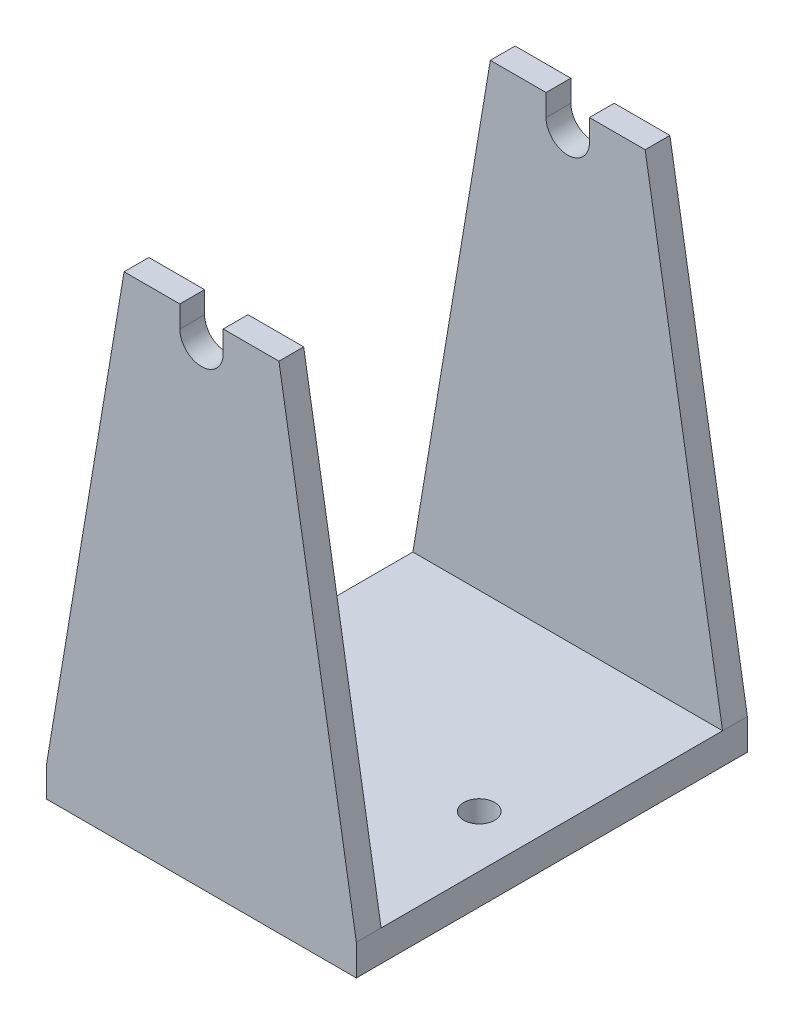
ISO-10303-21;
HEADER;
FILE_DESCRIPTION(('STEP AP214'),'2;1');
FILE_NAME('part.step','',(''),(''),'','','');
FILE_SCHEMA(('AUTOMOTIVE_DESIGN { 1 0 10303 214 1 1 1 1 }'));
ENDSEC;
DATA;
#1=APPLICATION_CONTEXT('core data for automotive mechanical design processes');
#2=APPLICATION_PROTOCOL_DEFINITION('international standard','automotive_design',2000,#1);
#3=PRODUCT_CONTEXT('',#1,'mechanical');
#4=PRODUCT('Part','Part','',(#3));
#5=PRODUCT_RELATED_PRODUCT_CATEGORY('part','',(#4));
#6=PRODUCT_DEFINITION_FORMATION('','',#4);
#7=PRODUCT_DEFINITION_CONTEXT('part definition',#1,'design');
#8=PRODUCT_DEFINITION('design','',#6,#7);
#9=PRODUCT_DEFINITION_SHAPE('','',#8);
#10=(LENGTH_UNIT() NAMED_UNIT(*) SI_UNIT(.MILLI.,.METRE.));
#11=(NAMED_UNIT(*) PLANE_ANGLE_UNIT() SI_UNIT($,.RADIAN.));
#12=(NAMED_UNIT(*) SI_UNIT($,.STERADIAN.) SOLID_ANGLE_UNIT());
#13=UNCERTAINTY_MEASURE_WITH_UNIT(LENGTH_MEASURE(1.E-05),#10,'distance_accuracy_value','');
#14=(GEOMETRIC_REPRESENTATION_CONTEXT(3) GLOBAL_UNCERTAINTY_ASSIGNED_CONTEXT((#13)) GLOBAL_UNIT_ASSIGNED_CONTEXT((#10,
#11,#12)) REPRESENTATION_CONTEXT('',''));
#15=CARTESIAN_POINT('',(0.,0.,0.));
#16=DIRECTION('',(0.,0.,1.));
#17=DIRECTION('',(1.,0.,0.));
#18=AXIS2_PLACEMENT_3D('',#15,#16,#17);
#19=CARTESIAN_POINT('',(0.,76.5,4.));
#20=DIRECTION('',(0.,0.,-1.));
#21=DIRECTION('',(-1.,0.,0.));
#22=AXIS2_PLACEMENT_3D('',#19,#20,#21);
#23=PLANE('',#22);
#24=DIRECTION('',(-1.,0.,0.));
#25=VECTOR('',#24,1.);
#26=CARTESIAN_POINT('',(-25.,5.,4.));
#27=LINE('',#26,#25);
#28=CARTESIAN_POINT('',(25.,5.00000000000001,4.));
#29=VERTEX_POINT('',#28);
#30=CARTESIAN_POINT('',(-25.,5.,4.));
#31=VERTEX_POINT('',#30);
#32=EDGE_CURVE('E121',#29,#31,#27,.T.);
#33=ORIENTED_EDGE('',*,*,#32,.F.);
#34=DIRECTION('',(-0.164398987305357,0.986393923832144,0.));
#35=VECTOR('',#34,1.);
#36=CARTESIAN_POINT('',(25.,5.00000000000001,4.));
#37=LINE('',#36,#35);
#38=CARTESIAN_POINT('',(12.5,80.,4.));
#39=VERTEX_POINT('',#38);
#40=EDGE_CURVE('E115',#29,#39,#37,.T.);
#41=ORIENTED_EDGE('',*,*,#40,.T.);
#42=DIRECTION('',(-1.,0.,0.));
#43=VECTOR('',#42,1.);
#44=CARTESIAN_POINT('',(12.5,80.,4.));
#45=LINE('',#44,#43);
#46=CARTESIAN_POINT('',(3.49999999999999,80.,4.));
#47=VERTEX_POINT('',#46);
#48=EDGE_CURVE('E118',#39,#47,#45,.T.);
#49=ORIENTED_EDGE('',*,*,#48,.T.);
#50=DIRECTION('',(0.,-1.,0.));
#51=VECTOR('',#50,1.);
#52=CARTESIAN_POINT('',(3.49999999999999,76.5,4.));
#53=LINE('',#52,#51);
#54=CARTESIAN_POINT('',(3.49999999999999,76.5,4.));
#55=VERTEX_POINT('',#54);
#56=EDGE_CURVE('E52',#47,#55,#53,.T.);
#57=ORIENTED_EDGE('',*,*,#56,.T.);
#58=CARTESIAN_POINT('',(0.,76.5,4.));
#59=DIRECTION('',(0.,0.,-1.));
#60=DIRECTION('',(-1.,0.,0.));
#61=AXIS2_PLACEMENT_3D('',#58,#59,#60);
#62=CIRCLE('',#61,3.5);
#63=CARTESIAN_POINT('',(-3.50000000000001,76.5,4.));
#64=VERTEX_POINT('',#63);
#65=EDGE_CURVE('E160',#55,#64,#62,.T.);
#66=ORIENTED_EDGE('',*,*,#65,.T.);
#67=DIRECTION('',(0.,1.,0.));
#68=VECTOR('',#67,1.);
#69=CARTESIAN_POINT('',(-3.50000000000001,76.5,4.));
#70=LINE('',#69,#68);
#71=CARTESIAN_POINT('',(-3.50000000000001,80.,4.));
#72=VERTEX_POINT('',#71);
#73=EDGE_CURVE('E102',#64,#72,#70,.T.);
#74=ORIENTED_EDGE('',*,*,#73,.T.);
#75=DIRECTION('',(-1.,0.,0.));
#76=VECTOR('',#75,1.);
#77=CARTESIAN_POINT('',(-12.5,80.,4.));
#78=LINE('',#77,#76);
#79=CARTESIAN_POINT('',(-12.5,80.,4.));
#80=VERTEX_POINT('',#79);
#81=EDGE_CURVE('E276',#72,#80,#78,.T.);
#82=ORIENTED_EDGE('',*,*,#81,.T.);
#83=DIRECTION('',(-0.164398987305357,-0.986393923832144,0.));
#84=VECTOR('',#83,1.);
#85=CARTESIAN_POINT('',(-25.,5.,4.));
#86=LINE('',#85,#84);
#87=EDGE_CURVE('E126',#80,#31,#86,.T.);
#88=ORIENTED_EDGE('',*,*,#87,.T.);
#89=EDGE_LOOP('',(#33,#41,#49,#57,#66,#74,#82,#88));
#90=FACE_BOUND('',#89,.T.);
#91=ADVANCED_FACE('F33',(#90),#23,.F.);
#92=CARTESIAN_POINT('',(0.,76.5,4.));
#93=DIRECTION('',(0.,0.,-1.));
#94=DIRECTION('',(-1.,0.,0.));
#95=AXIS2_PLACEMENT_3D('',#92,#93,#94);
#96=CYLINDRICAL_SURFACE('',#95,3.5);
#97=CARTESIAN_POINT('',(0.,76.5,0.));
#98=DIRECTION('',(0.,0.,-1.));
#99=DIRECTION('',(-1.,0.,0.));
#100=AXIS2_PLACEMENT_3D('',#97,#98,#99);
#101=CIRCLE('',#100,3.5);
#102=CARTESIAN_POINT('',(3.49999999999999,76.5,0.));
#103=VERTEX_POINT('',#102);
#104=CARTESIAN_POINT('',(-3.50000000000001,76.5,0.));
#105=VERTEX_POINT('',#104);
#106=EDGE_CURVE('E141',#103,#105,#101,.T.);
#107=ORIENTED_EDGE('',*,*,#106,.T.);
#108=DIRECTION('',(0.,0.,-1.));
#109=VECTOR('',#108,1.);
#110=CARTESIAN_POINT('',(-3.50000000000001,76.5,4.));
#111=LINE('',#110,#109);
#112=EDGE_CURVE('E11',#64,#105,#111,.T.);
#113=ORIENTED_EDGE('',*,*,#112,.F.);
#114=ORIENTED_EDGE('',*,*,#65,.F.);
#115=DIRECTION('',(0.,0.,-1.));
#116=VECTOR('',#115,1.);
#117=CARTESIAN_POINT('',(3.49999999999999,76.5,4.));
#118=LINE('',#117,#116);
#119=EDGE_CURVE('E137',#55,#103,#118,.T.);
#120=ORIENTED_EDGE('',*,*,#119,.T.);
#121=EDGE_LOOP('',(#107,#113,#114,#120));
#122=FACE_BOUND('',#121,.T.);
#123=ADVANCED_FACE('F35',(#122),#96,.F.);
#124=CARTESIAN_POINT('',(-3.50000000000001,76.5,4.));
#125=DIRECTION('',(-1.,0.,0.));
#126=DIRECTION('',(0.,-1.,0.));
#127=AXIS2_PLACEMENT_3D('',#124,#125,#126);
#128=PLANE('',#127);
#129=DIRECTION('',(0.,1.,0.));
#130=VECTOR('',#129,1.);
#131=CARTESIAN_POINT('',(-3.50000000000001,76.5,0.));
#132=LINE('',#131,#130);
#133=CARTESIAN_POINT('',(-3.50000000000001,80.,0.));
#134=VERTEX_POINT('',#133);
#135=EDGE_CURVE('E144',#105,#134,#132,.T.);
#136=ORIENTED_EDGE('',*,*,#135,.T.);
#137=DIRECTION('',(0.,0.,-1.));
#138=VECTOR('',#137,1.);
#139=CARTESIAN_POINT('',(-3.50000000000001,80.,4.));
#140=LINE('',#139,#138);
#141=EDGE_CURVE('E43',#72,#134,#140,.T.);
#142=ORIENTED_EDGE('',*,*,#141,.F.);
#143=ORIENTED_EDGE('',*,*,#73,.F.);
#144=ORIENTED_EDGE('',*,*,#112,.T.);
#145=EDGE_LOOP('',(#136,#142,#143,#144));
#146=FACE_BOUND('',#145,.T.);
#147=ADVANCED_FACE('F383',(#146),#128,.F.);
#148=CARTESIAN_POINT('',(-12.5,80.,4.));
#149=DIRECTION('',(0.,-1.,0.));
#150=DIRECTION('',(0.,0.,-1.));
#151=AXIS2_PLACEMENT_3D('',#148,#149,#150);
#152=PLANE('',#151);
#153=DIRECTION('',(-1.,0.,0.));
#154=VECTOR('',#153,1.);
#155=CARTESIAN_POINT('',(-12.5,80.,0.));
#156=LINE('',#155,#154);
#157=CARTESIAN_POINT('',(-12.5,80.,0.));
#158=VERTEX_POINT('',#157);
#159=EDGE_CURVE('E147',#134,#158,#156,.T.);
#160=ORIENTED_EDGE('',*,*,#159,.T.);
#161=DIRECTION('',(0.,0.,-1.));
#162=VECTOR('',#161,1.);
#163=CARTESIAN_POINT('',(-12.5,80.,4.));
#164=LINE('',#163,#162);
#165=EDGE_CURVE('E173',#80,#158,#164,.T.);
#166=ORIENTED_EDGE('',*,*,#165,.F.);
#167=ORIENTED_EDGE('',*,*,#81,.F.);
#168=ORIENTED_EDGE('',*,*,#141,.T.);
#169=EDGE_LOOP('',(#160,#166,#167,#168));
#170=FACE_BOUND('',#169,.T.);
#171=ADVANCED_FACE('F431',(#170),#152,.F.);
#172=CARTESIAN_POINT('',(-25.,5.,4.));
#173=DIRECTION('',(0.986393923832144,-0.164398987305357,0.));
#174=DIRECTION('',(0.164398987305357,0.986393923832144,0.));
#175=AXIS2_PLACEMENT_3D('',#172,#173,#174);
#176=PLANE('',#175);
#177=DIRECTION('',(-0.164398987305357,-0.986393923832144,0.));
#178=VECTOR('',#177,1.);
#179=CARTESIAN_POINT('',(-25.,5.,0.));
#180=LINE('',#179,#178);
#181=CARTESIAN_POINT('',(-25.,5.,0.));
#182=VERTEX_POINT('',#181);
#183=EDGE_CURVE('E149',#158,#182,#180,.T.);
#184=ORIENTED_EDGE('',*,*,#183,.T.);
#185=DIRECTION('',(0.,0.,-1.));
#186=VECTOR('',#185,1.);
#187=CARTESIAN_POINT('',(-25.,5.,4.));
#188=LINE('',#187,#186);
#189=EDGE_CURVE('E170',#31,#182,#188,.T.);
#190=ORIENTED_EDGE('',*,*,#189,.F.);
#191=ORIENTED_EDGE('',*,*,#87,.F.);
#192=ORIENTED_EDGE('',*,*,#165,.T.);
#193=EDGE_LOOP('',(#184,#190,#191,#192));
#194=FACE_BOUND('',#193,.T.);
#195=ADVANCED_FACE('F429',(#194),#176,.F.);
#196=CARTESIAN_POINT('',(-25.,0.,4.));
#197=DIRECTION('',(1.,0.,0.));
#198=DIRECTION('',(0.,1.,0.));
#199=AXIS2_PLACEMENT_3D('',#196,#197,#198);
#200=PLANE('',#199);
#201=DIRECTION('',(0.,-1.,0.));
#202=VECTOR('',#201,1.);
#203=CARTESIAN_POINT('',(-25.,0.,0.));
#204=LINE('',#203,#202);
#205=CARTESIAN_POINT('',(-25.,0.,0.));
#206=VERTEX_POINT('',#205);
#207=EDGE_CURVE('E151',#182,#206,#204,.T.);
#208=ORIENTED_EDGE('',*,*,#207,.T.);
#209=DIRECTION('',(0.,0.,-1.));
#210=VECTOR('',#209,1.);
#211=CARTESIAN_POINT('',(-25.,0.,4.));
#212=LINE('',#211,#210);
#213=CARTESIAN_POINT('',(-25.,0.,63.13));
#214=VERTEX_POINT('',#213);
#215=EDGE_CURVE('E167',#214,#206,#212,.T.);
#216=ORIENTED_EDGE('',*,*,#215,.F.);
#217=DIRECTION('',(0.,-1.,0.));
#218=VECTOR('',#217,1.);
#219=CARTESIAN_POINT('',(-25.,5.,63.13));
#220=LINE('',#219,#218);
#221=CARTESIAN_POINT('',(-25.,5.,63.13));
#222=VERTEX_POINT('',#221);
#223=EDGE_CURVE('E205',#222,#214,#220,.T.);
#224=ORIENTED_EDGE('',*,*,#223,.F.);
#225=DIRECTION('',(0.,0.,-1.));
#226=VECTOR('',#225,1.);
#227=CARTESIAN_POINT('',(-25.,5.,63.13));
#228=LINE('',#227,#226);
#229=CARTESIAN_POINT('',(-25.,5.,59.13));
#230=VERTEX_POINT('',#229);
#231=EDGE_CURVE('E254',#222,#230,#228,.T.);
#232=ORIENTED_EDGE('',*,*,#231,.T.);
#233=DIRECTION('',(0.,0.,-1.));
#234=VECTOR('',#233,1.);
#235=CARTESIAN_POINT('',(-25.,5.,59.13));
#236=LINE('',#235,#234);
#237=EDGE_CURVE('E269',#230,#31,#236,.T.);
#238=ORIENTED_EDGE('',*,*,#237,.T.);
#239=ORIENTED_EDGE('',*,*,#189,.T.);
#240=EDGE_LOOP('',(#208,#216,#224,#232,#238,#239));
#241=FACE_BOUND('',#240,.T.);
#242=ADVANCED_FACE('F290',(#241),#200,.F.);
#243=CARTESIAN_POINT('',(-25.,0.,4.));
#244=DIRECTION('',(0.,1.,0.));
#245=DIRECTION('',(-1.,0.,0.));
#246=AXIS2_PLACEMENT_3D('',#243,#244,#245);
#247=PLANE('',#246);
#248=CARTESIAN_POINT('',(-8.37977463032979,0.,34.9083674305388));
#249=DIRECTION('',(0.,1.,0.));
#250=DIRECTION('',(-1.,0.,0.));
#251=AXIS2_PLACEMENT_3D('',#248,#249,#250);
#252=CIRCLE('',#251,2.49999999999998);
#253=CARTESIAN_POINT('',(-10.8797746303298,0.,34.9083674305388));
#254=VERTEX_POINT('',#253);
#255=EDGE_CURVE('E37',#254,#254,#252,.T.);
#256=ORIENTED_EDGE('',*,*,#255,.T.);
#257=EDGE_LOOP('',(#256));
#258=FACE_BOUND('',#257,.T.);
#259=CARTESIAN_POINT('',(16.6202253696703,0.,34.9083674305388));
#260=DIRECTION('',(0.,1.,0.));
#261=DIRECTION('',(-1.,0.,0.));
#262=AXIS2_PLACEMENT_3D('',#259,#260,#261);
#263=CIRCLE('',#262,2.49999999999998);
#264=CARTESIAN_POINT('',(14.1202253696704,0.,34.9083674305388));
#265=VERTEX_POINT('',#264);
#266=EDGE_CURVE('E179',#265,#265,#263,.T.);
#267=ORIENTED_EDGE('',*,*,#266,.T.);
#268=EDGE_LOOP('',(#267));
#269=FACE_BOUND('',#268,.T.);
#270=DIRECTION('',(1.,0.,0.));
#271=VECTOR('',#270,1.);
#272=CARTESIAN_POINT('',(-25.,0.,0.));
#273=LINE('',#272,#271);
#274=CARTESIAN_POINT('',(25.,0.,0.));
#275=VERTEX_POINT('',#274);
#276=EDGE_CURVE('E153',#206,#275,#273,.T.);
#277=ORIENTED_EDGE('',*,*,#276,.T.);
#278=DIRECTION('',(0.,0.,-1.));
#279=VECTOR('',#278,1.);
#280=CARTESIAN_POINT('',(25.,0.,4.));
#281=LINE('',#280,#279);
#282=CARTESIAN_POINT('',(25.,0.,63.13));
#283=VERTEX_POINT('',#282);
#284=EDGE_CURVE('E164',#283,#275,#281,.T.);
#285=ORIENTED_EDGE('',*,*,#284,.F.);
#286=DIRECTION('',(1.,0.,0.));
#287=VECTOR('',#286,1.);
#288=CARTESIAN_POINT('',(-25.,0.,63.13));
#289=LINE('',#288,#287);
#290=EDGE_CURVE('E208',#214,#283,#289,.T.);
#291=ORIENTED_EDGE('',*,*,#290,.F.);
#292=ORIENTED_EDGE('',*,*,#215,.T.);
#293=EDGE_LOOP('',(#277,#285,#291,#292));
#294=FACE_BOUND('',#293,.T.);
#295=ADVANCED_FACE('F423',(#258,#269,#294),#247,.F.);
#296=CARTESIAN_POINT('',(25.,0.,4.));
#297=DIRECTION('',(-1.,0.,0.));
#298=DIRECTION('',(0.,0.,1.));
#299=AXIS2_PLACEMENT_3D('',#296,#297,#298);
#300=PLANE('',#299);
#301=DIRECTION('',(0.,1.,0.));
#302=VECTOR('',#301,1.);
#303=CARTESIAN_POINT('',(25.,0.,0.));
#304=LINE('',#303,#302);
#305=CARTESIAN_POINT('',(25.,5.00000000000001,0.));
#306=VERTEX_POINT('',#305);
#307=EDGE_CURVE('E155',#275,#306,#304,.T.);
#308=ORIENTED_EDGE('',*,*,#307,.T.);
#309=DIRECTION('',(0.,0.,-1.));
#310=VECTOR('',#309,1.);
#311=CARTESIAN_POINT('',(25.,5.00000000000001,4.));
#312=LINE('',#311,#310);
#313=EDGE_CURVE('E132',#29,#306,#312,.T.);
#314=ORIENTED_EDGE('',*,*,#313,.F.);
#315=DIRECTION('',(0.,0.,-1.));
#316=VECTOR('',#315,1.);
#317=CARTESIAN_POINT('',(25.,5.,59.13));
#318=LINE('',#317,#316);
#319=CARTESIAN_POINT('',(25.,5.,59.13));
#320=VERTEX_POINT('',#319);
#321=EDGE_CURVE('E145',#320,#29,#318,.T.);
#322=ORIENTED_EDGE('',*,*,#321,.F.);
#323=DIRECTION('',(0.,0.,-1.));
#324=VECTOR('',#323,1.);
#325=CARTESIAN_POINT('',(25.,5.00000000000001,63.13));
#326=LINE('',#325,#324);
#327=CARTESIAN_POINT('',(25.,5.00000000000001,63.13));
#328=VERTEX_POINT('',#327);
#329=EDGE_CURVE('E251',#328,#320,#326,.T.);
#330=ORIENTED_EDGE('',*,*,#329,.F.);
#331=DIRECTION('',(0.,1.,0.));
#332=VECTOR('',#331,1.);
#333=CARTESIAN_POINT('',(25.,0.,63.13));
#334=LINE('',#333,#332);
#335=EDGE_CURVE('E211',#283,#328,#334,.T.);
#336=ORIENTED_EDGE('',*,*,#335,.F.);
#337=ORIENTED_EDGE('',*,*,#284,.T.);
#338=EDGE_LOOP('',(#308,#314,#322,#330,#336,#337));
#339=FACE_BOUND('',#338,.T.);
#340=ADVANCED_FACE('F335',(#339),#300,.F.);
#341=CARTESIAN_POINT('',(25.,5.00000000000001,4.));
#342=DIRECTION('',(-0.986393923832144,-0.164398987305357,0.));
#343=DIRECTION('',(0.164398987305357,-0.986393923832144,0.));
#344=AXIS2_PLACEMENT_3D('',#341,#342,#343);
#345=PLANE('',#344);
#346=DIRECTION('',(-0.164398987305357,0.986393923832144,0.));
#347=VECTOR('',#346,1.);
#348=CARTESIAN_POINT('',(25.,5.00000000000001,0.));
#349=LINE('',#348,#347);
#350=CARTESIAN_POINT('',(12.5,80.,0.));
#351=VERTEX_POINT('',#350);
#352=EDGE_CURVE('E131',#306,#351,#349,.T.);
#353=ORIENTED_EDGE('',*,*,#352,.T.);
#354=DIRECTION('',(0.,0.,-1.));
#355=VECTOR('',#354,1.);
#356=CARTESIAN_POINT('',(12.5,80.,4.));
#357=LINE('',#356,#355);
#358=EDGE_CURVE('E128',#39,#351,#357,.T.);
#359=ORIENTED_EDGE('',*,*,#358,.F.);
#360=ORIENTED_EDGE('',*,*,#40,.F.);
#361=ORIENTED_EDGE('',*,*,#313,.T.);
#362=EDGE_LOOP('',(#353,#359,#360,#361));
#363=FACE_BOUND('',#362,.T.);
#364=ADVANCED_FACE('F129',(#363),#345,.F.);
#365=CARTESIAN_POINT('',(12.5,80.,4.));
#366=DIRECTION('',(0.,-1.,0.));
#367=DIRECTION('',(1.,0.,0.));
#368=AXIS2_PLACEMENT_3D('',#365,#366,#367);
#369=PLANE('',#368);
#370=DIRECTION('',(-1.,0.,0.));
#371=VECTOR('',#370,1.);
#372=CARTESIAN_POINT('',(12.5,80.,0.));
#373=LINE('',#372,#371);
#374=CARTESIAN_POINT('',(3.49999999999999,80.,0.));
#375=VERTEX_POINT('',#374);
#376=EDGE_CURVE('E88',#351,#375,#373,.T.);
#377=ORIENTED_EDGE('',*,*,#376,.T.);
#378=DIRECTION('',(0.,0.,-1.));
#379=VECTOR('',#378,1.);
#380=CARTESIAN_POINT('',(3.49999999999999,80.,4.));
#381=LINE('',#380,#379);
#382=EDGE_CURVE('E133',#47,#375,#381,.T.);
#383=ORIENTED_EDGE('',*,*,#382,.F.);
#384=ORIENTED_EDGE('',*,*,#48,.F.);
#385=ORIENTED_EDGE('',*,*,#358,.T.);
#386=EDGE_LOOP('',(#377,#383,#384,#385));
#387=FACE_BOUND('',#386,.T.);
#388=ADVANCED_FACE('F135',(#387),#369,.F.);
#389=CARTESIAN_POINT('',(3.49999999999999,76.5,4.));
#390=DIRECTION('',(1.,0.,0.));
#391=DIRECTION('',(0.,1.,0.));
#392=AXIS2_PLACEMENT_3D('',#389,#390,#391);
#393=PLANE('',#392);
#394=DIRECTION('',(0.,-1.,0.));
#395=VECTOR('',#394,1.);
#396=CARTESIAN_POINT('',(3.49999999999999,76.5,0.));
#397=LINE('',#396,#395);
#398=EDGE_CURVE('E94',#375,#103,#397,.T.);
#399=ORIENTED_EDGE('',*,*,#398,.T.);
#400=ORIENTED_EDGE('',*,*,#119,.F.);
#401=ORIENTED_EDGE('',*,*,#56,.F.);
#402=ORIENTED_EDGE('',*,*,#382,.T.);
#403=EDGE_LOOP('',(#399,#400,#401,#402));
#404=FACE_BOUND('',#403,.T.);
#405=ADVANCED_FACE('F369',(#404),#393,.F.);
#406=CARTESIAN_POINT('',(0.,76.5,0.));
#407=DIRECTION('',(0.,0.,-1.));
#408=DIRECTION('',(-1.,0.,0.));
#409=AXIS2_PLACEMENT_3D('',#406,#407,#408);
#410=PLANE('',#409);
#411=ORIENTED_EDGE('',*,*,#106,.F.);
#412=ORIENTED_EDGE('',*,*,#398,.F.);
#413=ORIENTED_EDGE('',*,*,#376,.F.);
#414=ORIENTED_EDGE('',*,*,#352,.F.);
#415=ORIENTED_EDGE('',*,*,#307,.F.);
#416=ORIENTED_EDGE('',*,*,#276,.F.);
#417=ORIENTED_EDGE('',*,*,#207,.F.);
#418=ORIENTED_EDGE('',*,*,#183,.F.);
#419=ORIENTED_EDGE('',*,*,#159,.F.);
#420=ORIENTED_EDGE('',*,*,#135,.F.);
#421=EDGE_LOOP('',(#411,#412,#413,#414,#415,#416,#417,#418,#419,#420));
#422=FACE_BOUND('',#421,.T.);
#423=ADVANCED_FACE('F364',(#422),#410,.T.);
#424=CARTESIAN_POINT('',(-25.,5.,59.13));
#425=DIRECTION('',(0.,-1.,0.));
#426=DIRECTION('',(0.,0.,-1.));
#427=AXIS2_PLACEMENT_3D('',#424,#425,#426);
#428=PLANE('',#427);
#429=CARTESIAN_POINT('',(-8.37977463032979,5.,34.9083674305388));
#430=DIRECTION('',(0.,-1.,0.));
#431=DIRECTION('',(0.,0.,-1.));
#432=AXIS2_PLACEMENT_3D('',#429,#430,#431);
#433=CIRCLE('',#432,2.49999999999998);
#434=CARTESIAN_POINT('',(-8.37977463032979,5.,32.4083674305388));
#435=VERTEX_POINT('',#434);
#436=EDGE_CURVE('E180',#435,#435,#433,.T.);
#437=ORIENTED_EDGE('',*,*,#436,.T.);
#438=EDGE_LOOP('',(#437));
#439=FACE_BOUND('',#438,.T.);
#440=CARTESIAN_POINT('',(16.6202253696703,5.,34.9083674305388));
#441=DIRECTION('',(0.,-1.,0.));
#442=DIRECTION('',(0.,0.,-1.));
#443=AXIS2_PLACEMENT_3D('',#440,#441,#442);
#444=CIRCLE('',#443,2.49999999999998);
#445=CARTESIAN_POINT('',(16.6202253696703,5.,32.4083674305388));
#446=VERTEX_POINT('',#445);
#447=EDGE_CURVE('E177',#446,#446,#444,.T.);
#448=ORIENTED_EDGE('',*,*,#447,.T.);
#449=EDGE_LOOP('',(#448));
#450=FACE_BOUND('',#449,.T.);
#451=ORIENTED_EDGE('',*,*,#32,.T.);
#452=ORIENTED_EDGE('',*,*,#237,.F.);
#453=DIRECTION('',(-1.,0.,0.));
#454=VECTOR('',#453,1.);
#455=CARTESIAN_POINT('',(-25.,5.,59.13));
#456=LINE('',#455,#454);
#457=EDGE_CURVE('E266',#320,#230,#456,.T.);
#458=ORIENTED_EDGE('',*,*,#457,.F.);
#459=ORIENTED_EDGE('',*,*,#321,.T.);
#460=EDGE_LOOP('',(#451,#452,#458,#459));
#461=FACE_BOUND('',#460,.T.);
#462=ADVANCED_FACE('F285',(#439,#450,#461),#428,.F.);
#463=CARTESIAN_POINT('',(0.,76.5,59.13));
#464=DIRECTION('',(0.,0.,1.));
#465=DIRECTION('',(1.,0.,0.));
#466=AXIS2_PLACEMENT_3D('',#463,#464,#465);
#467=PLANE('',#466);
#468=DIRECTION('',(-0.164398987305357,0.986393923832144,0.));
#469=VECTOR('',#468,1.);
#470=CARTESIAN_POINT('',(25.,5.00000000000001,59.13));
#471=LINE('',#470,#469);
#472=CARTESIAN_POINT('',(12.5,80.,59.13));
#473=VERTEX_POINT('',#472);
#474=EDGE_CURVE('E235',#320,#473,#471,.T.);
#475=ORIENTED_EDGE('',*,*,#474,.F.);
#476=ORIENTED_EDGE('',*,*,#457,.T.);
#477=DIRECTION('',(-0.164398987305357,-0.986393923832144,0.));
#478=VECTOR('',#477,1.);
#479=CARTESIAN_POINT('',(-12.5,80.,59.13));
#480=LINE('',#479,#478);
#481=CARTESIAN_POINT('',(-12.5,80.,59.13));
#482=VERTEX_POINT('',#481);
#483=EDGE_CURVE('E232',#482,#230,#480,.T.);
#484=ORIENTED_EDGE('',*,*,#483,.F.);
#485=DIRECTION('',(-1.,0.,0.));
#486=VECTOR('',#485,1.);
#487=CARTESIAN_POINT('',(-3.50000000000001,80.,59.13));
#488=LINE('',#487,#486);
#489=CARTESIAN_POINT('',(-3.50000000000001,80.,59.13));
#490=VERTEX_POINT('',#489);
#491=EDGE_CURVE('E229',#490,#482,#488,.T.);
#492=ORIENTED_EDGE('',*,*,#491,.F.);
#493=DIRECTION('',(0.,1.,0.));
#494=VECTOR('',#493,1.);
#495=CARTESIAN_POINT('',(-3.50000000000001,76.5,59.13));
#496=LINE('',#495,#494);
#497=CARTESIAN_POINT('',(-3.50000000000001,76.5,59.13));
#498=VERTEX_POINT('',#497);
#499=EDGE_CURVE('E226',#498,#490,#496,.T.);
#500=ORIENTED_EDGE('',*,*,#499,.F.);
#501=CARTESIAN_POINT('',(0.,76.5,59.13));
#502=DIRECTION('',(0.,0.,-1.));
#503=DIRECTION('',(1.,0.,0.));
#504=AXIS2_PLACEMENT_3D('',#501,#502,#503);
#505=CIRCLE('',#504,3.5);
#506=CARTESIAN_POINT('',(3.49999999999999,76.5,59.13));
#507=VERTEX_POINT('',#506);
#508=EDGE_CURVE('E184',#507,#498,#505,.T.);
#509=ORIENTED_EDGE('',*,*,#508,.F.);
#510=DIRECTION('',(0.,-1.,0.));
#511=VECTOR('',#510,1.);
#512=CARTESIAN_POINT('',(3.49999999999999,80.,59.13));
#513=LINE('',#512,#511);
#514=CARTESIAN_POINT('',(3.49999999999999,80.,59.13));
#515=VERTEX_POINT('',#514);
#516=EDGE_CURVE('E196',#515,#507,#513,.T.);
#517=ORIENTED_EDGE('',*,*,#516,.F.);
#518=DIRECTION('',(-1.,0.,0.));
#519=VECTOR('',#518,1.);
#520=CARTESIAN_POINT('',(12.5,80.,59.13));
#521=LINE('',#520,#519);
#522=EDGE_CURVE('E238',#473,#515,#521,.T.);
#523=ORIENTED_EDGE('',*,*,#522,.F.);
#524=EDGE_LOOP('',(#475,#476,#484,#492,#500,#509,#517,#523));
#525=FACE_BOUND('',#524,.T.);
#526=ADVANCED_FACE('F344',(#525),#467,.F.);
#527=CARTESIAN_POINT('',(0.,76.5,63.13));
#528=DIRECTION('',(0.,0.,-1.));
#529=DIRECTION('',(-1.,0.,0.));
#530=AXIS2_PLACEMENT_3D('',#527,#528,#529);
#531=CYLINDRICAL_SURFACE('',#530,3.5);
#532=ORIENTED_EDGE('',*,*,#508,.T.);
#533=DIRECTION('',(0.,0.,-1.));
#534=VECTOR('',#533,1.);
#535=CARTESIAN_POINT('',(-3.50000000000001,76.5,63.13));
#536=LINE('',#535,#534);
#537=CARTESIAN_POINT('',(-3.50000000000001,76.5,63.13));
#538=VERTEX_POINT('',#537);
#539=EDGE_CURVE('E263',#538,#498,#536,.T.);
#540=ORIENTED_EDGE('',*,*,#539,.F.);
#541=CARTESIAN_POINT('',(0.,76.5,63.13));
#542=DIRECTION('',(0.,0.,-1.));
#543=DIRECTION('',(1.,0.,0.));
#544=AXIS2_PLACEMENT_3D('',#541,#542,#543);
#545=CIRCLE('',#544,3.5);
#546=CARTESIAN_POINT('',(3.49999999999999,76.5,63.13));
#547=VERTEX_POINT('',#546);
#548=EDGE_CURVE('E192',#547,#538,#545,.T.);
#549=ORIENTED_EDGE('',*,*,#548,.F.);
#550=DIRECTION('',(0.,0.,-1.));
#551=VECTOR('',#550,1.);
#552=CARTESIAN_POINT('',(3.49999999999999,76.5,63.13));
#553=LINE('',#552,#551);
#554=EDGE_CURVE('E223',#547,#507,#553,.T.);
#555=ORIENTED_EDGE('',*,*,#554,.T.);
#556=EDGE_LOOP('',(#532,#540,#549,#555));
#557=FACE_BOUND('',#556,.T.);
#558=ADVANCED_FACE('F387',(#557),#531,.F.);
#559=CARTESIAN_POINT('',(-3.50000000000001,76.5,63.13));
#560=DIRECTION('',(-1.,0.,0.));
#561=DIRECTION('',(0.,-1.,0.));
#562=AXIS2_PLACEMENT_3D('',#559,#560,#561);
#563=PLANE('',#562);
#564=ORIENTED_EDGE('',*,*,#499,.T.);
#565=DIRECTION('',(0.,0.,-1.));
#566=VECTOR('',#565,1.);
#567=CARTESIAN_POINT('',(-3.50000000000001,80.,63.13));
#568=LINE('',#567,#566);
#569=CARTESIAN_POINT('',(-3.50000000000001,80.,63.13));
#570=VERTEX_POINT('',#569);
#571=EDGE_CURVE('E260',#570,#490,#568,.T.);
#572=ORIENTED_EDGE('',*,*,#571,.F.);
#573=DIRECTION('',(0.,1.,0.));
#574=VECTOR('',#573,1.);
#575=CARTESIAN_POINT('',(-3.50000000000001,76.5,63.13));
#576=LINE('',#575,#574);
#577=EDGE_CURVE('E195',#538,#570,#576,.T.);
#578=ORIENTED_EDGE('',*,*,#577,.F.);
#579=ORIENTED_EDGE('',*,*,#539,.T.);
#580=EDGE_LOOP('',(#564,#572,#578,#579));
#581=FACE_BOUND('',#580,.T.);
#582=ADVANCED_FACE('F390',(#581),#563,.F.);
#583=CARTESIAN_POINT('',(-3.50000000000001,80.,63.13));
#584=DIRECTION('',(0.,-1.,0.));
#585=DIRECTION('',(0.,0.,-1.));
#586=AXIS2_PLACEMENT_3D('',#583,#584,#585);
#587=PLANE('',#586);
#588=ORIENTED_EDGE('',*,*,#491,.T.);
#589=DIRECTION('',(0.,0.,-1.));
#590=VECTOR('',#589,1.);
#591=CARTESIAN_POINT('',(-12.5,80.,63.13));
#592=LINE('',#591,#590);
#593=CARTESIAN_POINT('',(-12.5,80.,63.13));
#594=VERTEX_POINT('',#593);
#595=EDGE_CURVE('E257',#594,#482,#592,.T.);
#596=ORIENTED_EDGE('',*,*,#595,.F.);
#597=DIRECTION('',(-1.,0.,0.));
#598=VECTOR('',#597,1.);
#599=CARTESIAN_POINT('',(-3.50000000000001,80.,63.13));
#600=LINE('',#599,#598);
#601=EDGE_CURVE('E199',#570,#594,#600,.T.);
#602=ORIENTED_EDGE('',*,*,#601,.F.);
#603=ORIENTED_EDGE('',*,*,#571,.T.);
#604=EDGE_LOOP('',(#588,#596,#602,#603));
#605=FACE_BOUND('',#604,.T.);
#606=ADVANCED_FACE('F394',(#605),#587,.F.);
#607=CARTESIAN_POINT('',(-12.5,80.,63.13));
#608=DIRECTION('',(0.986393923832144,-0.164398987305357,0.));
#609=DIRECTION('',(0.164398987305357,0.986393923832144,0.));
#610=AXIS2_PLACEMENT_3D('',#607,#608,#609);
#611=PLANE('',#610);
#612=ORIENTED_EDGE('',*,*,#483,.T.);
#613=ORIENTED_EDGE('',*,*,#231,.F.);
#614=DIRECTION('',(-0.164398987305357,-0.986393923832144,0.));
#615=VECTOR('',#614,1.);
#616=CARTESIAN_POINT('',(-12.5,80.,63.13));
#617=LINE('',#616,#615);
#618=EDGE_CURVE('E202',#594,#222,#617,.T.);
#619=ORIENTED_EDGE('',*,*,#618,.F.);
#620=ORIENTED_EDGE('',*,*,#595,.T.);
#621=EDGE_LOOP('',(#612,#613,#619,#620));
#622=FACE_BOUND('',#621,.T.);
#623=ADVANCED_FACE('F301',(#622),#611,.F.);
#624=CARTESIAN_POINT('',(25.,5.00000000000001,63.13));
#625=DIRECTION('',(-0.986393923832144,-0.164398987305357,0.));
#626=DIRECTION('',(0.164398987305357,-0.986393923832144,0.));
#627=AXIS2_PLACEMENT_3D('',#624,#625,#626);
#628=PLANE('',#627);
#629=ORIENTED_EDGE('',*,*,#474,.T.);
#630=DIRECTION('',(0.,0.,-1.));
#631=VECTOR('',#630,1.);
#632=CARTESIAN_POINT('',(12.5,80.,63.13));
#633=LINE('',#632,#631);
#634=CARTESIAN_POINT('',(12.5,80.,63.13));
#635=VERTEX_POINT('',#634);
#636=EDGE_CURVE('E248',#635,#473,#633,.T.);
#637=ORIENTED_EDGE('',*,*,#636,.F.);
#638=DIRECTION('',(-0.164398987305357,0.986393923832144,0.));
#639=VECTOR('',#638,1.);
#640=CARTESIAN_POINT('',(25.,5.00000000000001,63.13));
#641=LINE('',#640,#639);
#642=EDGE_CURVE('E214',#328,#635,#641,.T.);
#643=ORIENTED_EDGE('',*,*,#642,.F.);
#644=ORIENTED_EDGE('',*,*,#329,.T.);
#645=EDGE_LOOP('',(#629,#637,#643,#644));
#646=FACE_BOUND('',#645,.T.);
#647=ADVANCED_FACE('F341',(#646),#628,.F.);
#648=CARTESIAN_POINT('',(12.5,80.,63.13));
#649=DIRECTION('',(0.,-1.,0.));
#650=DIRECTION('',(1.,0.,0.));
#651=AXIS2_PLACEMENT_3D('',#648,#649,#650);
#652=PLANE('',#651);
#653=ORIENTED_EDGE('',*,*,#522,.T.);
#654=DIRECTION('',(0.,0.,-1.));
#655=VECTOR('',#654,1.);
#656=CARTESIAN_POINT('',(3.49999999999999,80.,63.13));
#657=LINE('',#656,#655);
#658=CARTESIAN_POINT('',(3.49999999999999,80.,63.13));
#659=VERTEX_POINT('',#658);
#660=EDGE_CURVE('E245',#659,#515,#657,.T.);
#661=ORIENTED_EDGE('',*,*,#660,.F.);
#662=DIRECTION('',(-1.,0.,0.));
#663=VECTOR('',#662,1.);
#664=CARTESIAN_POINT('',(12.5,80.,63.13));
#665=LINE('',#664,#663);
#666=EDGE_CURVE('E217',#635,#659,#665,.T.);
#667=ORIENTED_EDGE('',*,*,#666,.F.);
#668=ORIENTED_EDGE('',*,*,#636,.T.);
#669=EDGE_LOOP('',(#653,#661,#667,#668));
#670=FACE_BOUND('',#669,.T.);
#671=ADVANCED_FACE('F349',(#670),#652,.F.);
#672=CARTESIAN_POINT('',(3.49999999999999,80.,63.13));
#673=DIRECTION('',(1.,0.,0.));
#674=DIRECTION('',(0.,1.,0.));
#675=AXIS2_PLACEMENT_3D('',#672,#673,#674);
#676=PLANE('',#675);
#677=ORIENTED_EDGE('',*,*,#516,.T.);
#678=ORIENTED_EDGE('',*,*,#554,.F.);
#679=DIRECTION('',(0.,-1.,0.));
#680=VECTOR('',#679,1.);
#681=CARTESIAN_POINT('',(3.49999999999999,80.,63.13));
#682=LINE('',#681,#680);
#683=EDGE_CURVE('E220',#659,#547,#682,.T.);
#684=ORIENTED_EDGE('',*,*,#683,.F.);
#685=ORIENTED_EDGE('',*,*,#660,.T.);
#686=EDGE_LOOP('',(#677,#678,#684,#685));
#687=FACE_BOUND('',#686,.T.);
#688=ADVANCED_FACE('F353',(#687),#676,.F.);
#689=CARTESIAN_POINT('',(0.,76.5,63.13));
#690=DIRECTION('',(0.,0.,1.));
#691=DIRECTION('',(1.,0.,0.));
#692=AXIS2_PLACEMENT_3D('',#689,#690,#691);
#693=PLANE('',#692);
#694=ORIENTED_EDGE('',*,*,#548,.T.);
#695=ORIENTED_EDGE('',*,*,#577,.T.);
#696=ORIENTED_EDGE('',*,*,#601,.T.);
#697=ORIENTED_EDGE('',*,*,#618,.T.);
#698=ORIENTED_EDGE('',*,*,#223,.T.);
#699=ORIENTED_EDGE('',*,*,#290,.T.);
#700=ORIENTED_EDGE('',*,*,#335,.T.);
#701=ORIENTED_EDGE('',*,*,#642,.T.);
#702=ORIENTED_EDGE('',*,*,#666,.T.);
#703=ORIENTED_EDGE('',*,*,#683,.T.);
#704=EDGE_LOOP('',(#694,#695,#696,#697,#698,#699,#700,#701,#702,#703));
#705=FACE_BOUND('',#704,.T.);
#706=ADVANCED_FACE('F356',(#705),#693,.T.);
#707=CARTESIAN_POINT('',(16.6202253696703,-5.00000000000001,34.9083674305388));
#708=DIRECTION('',(0.,-1.,0.));
#709=DIRECTION('',(0.,0.,-1.));
#710=AXIS2_PLACEMENT_3D('',#707,#708,#709);
#711=CYLINDRICAL_SURFACE('',#710,2.49999999999998);
#712=ORIENTED_EDGE('',*,*,#447,.F.);
#713=EDGE_LOOP('',(#712));
#714=FACE_BOUND('',#713,.T.);
#715=ORIENTED_EDGE('',*,*,#266,.F.);
#716=EDGE_LOOP('',(#715));
#717=FACE_BOUND('',#716,.T.);
#718=ADVANCED_FACE('F411',(#714,#717),#711,.F.);
#719=CARTESIAN_POINT('',(-8.37977463032979,-5.00000000000001,34.9083674305388));
#720=DIRECTION('',(0.,-1.,0.));
#721=DIRECTION('',(0.,0.,-1.));
#722=AXIS2_PLACEMENT_3D('',#719,#720,#721);
#723=CYLINDRICAL_SURFACE('',#722,2.49999999999998);
#724=ORIENTED_EDGE('',*,*,#255,.F.);
#725=EDGE_LOOP('',(#724));
#726=FACE_BOUND('',#725,.T.);
#727=ORIENTED_EDGE('',*,*,#436,.F.);
#728=EDGE_LOOP('',(#727));
#729=FACE_BOUND('',#728,.T.);
#730=ADVANCED_FACE('F414',(#726,#729),#723,.F.);
#731=CLOSED_SHELL('',(#91,#123,#147,#171,#195,#242,#295,#340,#364,#388,#405,#423,#462,#526,#558,
#582,#606,#623,#647,#671,#688,#706,#718,#730));
#732=MANIFOLD_SOLID_BREP('B2',#731);
#733=ADVANCED_BREP_SHAPE_REPRESENTATION('',(#18,#732),#14);
#734=SHAPE_DEFINITION_REPRESENTATION(#9,#733);
ENDSEC;
END-ISO-10303-21;
